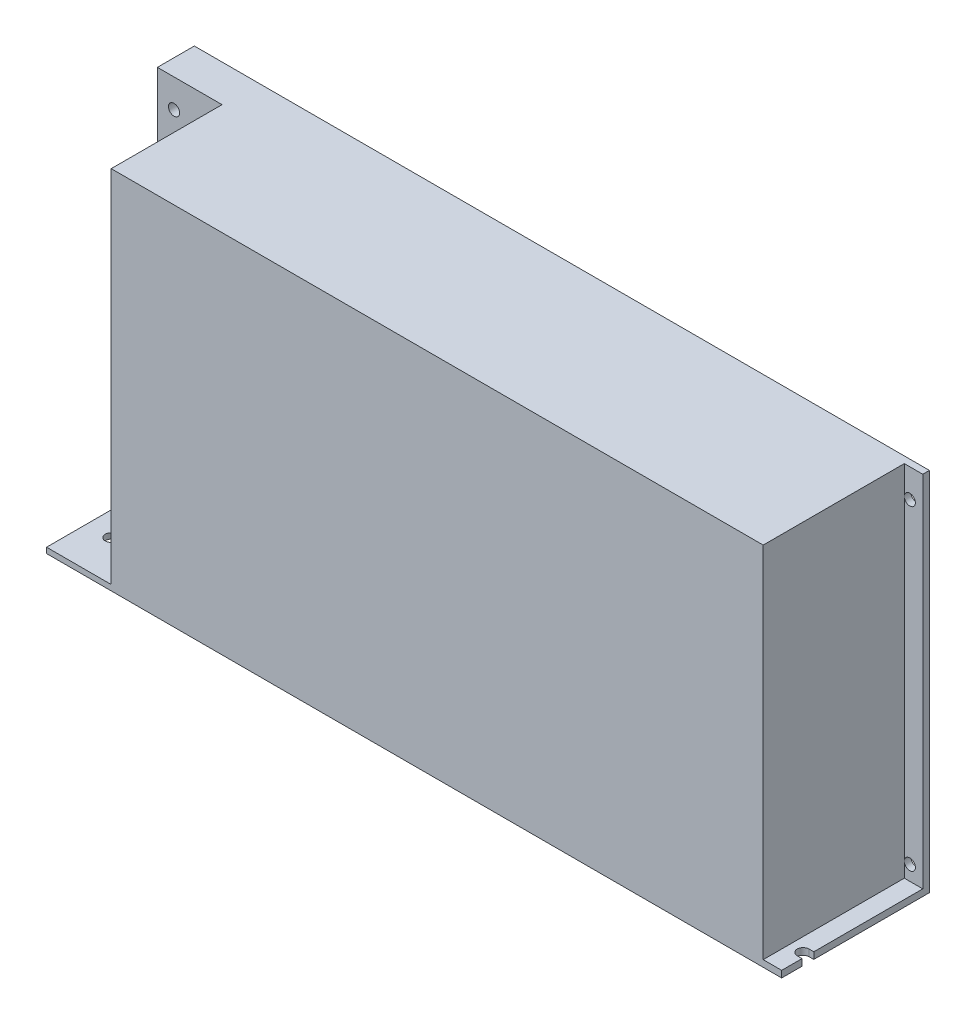
ISO-10303-21;
HEADER;
FILE_DESCRIPTION(('STEP AP214'),'2;1');
FILE_NAME('part.step','',(''),(''),'','','');
FILE_SCHEMA(('AUTOMOTIVE_DESIGN { 1 0 10303 214 1 1 1 1 }'));
ENDSEC;
DATA;
#1=APPLICATION_CONTEXT('core data for automotive mechanical design processes');
#2=APPLICATION_PROTOCOL_DEFINITION('international standard','automotive_design',2000,#1);
#3=PRODUCT_CONTEXT('',#1,'mechanical');
#4=PRODUCT('Part','Part','',(#3));
#5=PRODUCT_RELATED_PRODUCT_CATEGORY('part','',(#4));
#6=PRODUCT_DEFINITION_FORMATION('','',#4);
#7=PRODUCT_DEFINITION_CONTEXT('part definition',#1,'design');
#8=PRODUCT_DEFINITION('design','',#6,#7);
#9=PRODUCT_DEFINITION_SHAPE('','',#8);
#10=(LENGTH_UNIT() NAMED_UNIT(*) SI_UNIT(.MILLI.,.METRE.));
#11=(NAMED_UNIT(*) PLANE_ANGLE_UNIT() SI_UNIT($,.RADIAN.));
#12=(NAMED_UNIT(*) SI_UNIT($,.STERADIAN.) SOLID_ANGLE_UNIT());
#13=UNCERTAINTY_MEASURE_WITH_UNIT(LENGTH_MEASURE(1.E-05),#10,'distance_accuracy_value','');
#14=(GEOMETRIC_REPRESENTATION_CONTEXT(3) GLOBAL_UNCERTAINTY_ASSIGNED_CONTEXT((#13)) GLOBAL_UNIT_ASSIGNED_CONTEXT((#10,
#11,#12)) REPRESENTATION_CONTEXT('',''));
#15=CARTESIAN_POINT('',(0.,0.,0.));
#16=DIRECTION('',(0.,0.,1.));
#17=DIRECTION('',(1.,0.,0.));
#18=AXIS2_PLACEMENT_3D('',#15,#16,#17);
#19=CARTESIAN_POINT('',(99.5,49.5,40.));
#20=DIRECTION('',(-1.,0.,0.));
#21=DIRECTION('',(0.,0.,1.));
#22=AXIS2_PLACEMENT_3D('',#19,#20,#21);
#23=PLANE('',#22);
#24=DIRECTION('',(0.,0.,-1.));
#25=VECTOR('',#24,1.);
#26=CARTESIAN_POINT('',(99.5,-49.5,40.));
#27=LINE('',#26,#25);
#28=CARTESIAN_POINT('',(99.5,-49.5,40.));
#29=VERTEX_POINT('',#28);
#30=CARTESIAN_POINT('',(99.5,-49.5,34.5));
#31=VERTEX_POINT('',#30);
#32=EDGE_CURVE('E323',#29,#31,#27,.T.);
#33=ORIENTED_EDGE('',*,*,#32,.T.);
#34=DIRECTION('',(0.,-1.,0.));
#35=VECTOR('',#34,1.);
#36=CARTESIAN_POINT('',(99.5,-39.5,34.5));
#37=LINE('',#36,#35);
#38=CARTESIAN_POINT('',(99.5,-47.7,34.5));
#39=VERTEX_POINT('',#38);
#40=EDGE_CURVE('E171',#39,#31,#37,.T.);
#41=ORIENTED_EDGE('',*,*,#40,.F.);
#42=DIRECTION('',(0.,0.,1.));
#43=VECTOR('',#42,1.);
#44=CARTESIAN_POINT('',(99.5,-47.7,40.));
#45=LINE('',#44,#43);
#46=CARTESIAN_POINT('',(99.5,-47.7,40.));
#47=VERTEX_POINT('',#46);
#48=EDGE_CURVE('E259',#39,#47,#45,.T.);
#49=ORIENTED_EDGE('',*,*,#48,.T.);
#50=DIRECTION('',(0.,1.,0.));
#51=VECTOR('',#50,1.);
#52=CARTESIAN_POINT('',(99.5,49.5,40.));
#53=LINE('',#52,#51);
#54=EDGE_CURVE('E303',#29,#47,#53,.T.);
#55=ORIENTED_EDGE('',*,*,#54,.F.);
#56=EDGE_LOOP('',(#33,#41,#49,#55));
#57=FACE_BOUND('',#56,.T.);
#58=ADVANCED_FACE('F34',(#57),#23,.F.);
#59=CARTESIAN_POINT('',(-99.5,-49.5,0.));
#60=DIRECTION('',(0.,0.,1.));
#61=DIRECTION('',(1.,0.,0.));
#62=AXIS2_PLACEMENT_3D('',#59,#60,#61);
#63=PLANE('',#62);
#64=CARTESIAN_POINT('',(-95.,41.8,0.));
#65=DIRECTION('',(0.,0.,-1.));
#66=DIRECTION('',(1.,0.,0.));
#67=AXIS2_PLACEMENT_3D('',#64,#65,#66);
#68=CIRCLE('',#67,1.5);
#69=CARTESIAN_POINT('',(-93.5,41.8,0.));
#70=VERTEX_POINT('',#69);
#71=EDGE_CURVE('E349',#70,#70,#68,.T.);
#72=ORIENTED_EDGE('',*,*,#71,.F.);
#73=EDGE_LOOP('',(#72));
#74=FACE_BOUND('',#73,.T.);
#75=CARTESIAN_POINT('',(-95.,-43.7,0.));
#76=DIRECTION('',(0.,0.,-1.));
#77=DIRECTION('',(-1.,0.,0.));
#78=AXIS2_PLACEMENT_3D('',#75,#76,#77);
#79=CIRCLE('',#78,1.5);
#80=CARTESIAN_POINT('',(-96.5,-43.7,0.));
#81=VERTEX_POINT('',#80);
#82=EDGE_CURVE('E339',#81,#81,#79,.T.);
#83=ORIENTED_EDGE('',*,*,#82,.F.);
#84=EDGE_LOOP('',(#83));
#85=FACE_BOUND('',#84,.T.);
#86=CARTESIAN_POINT('',(96.,-43.7,0.));
#87=DIRECTION('',(0.,0.,-1.));
#88=DIRECTION('',(1.,0.,0.));
#89=AXIS2_PLACEMENT_3D('',#86,#87,#88);
#90=CIRCLE('',#89,1.5);
#91=CARTESIAN_POINT('',(97.5,-43.7,0.));
#92=VERTEX_POINT('',#91);
#93=EDGE_CURVE('E336',#92,#92,#90,.T.);
#94=ORIENTED_EDGE('',*,*,#93,.F.);
#95=EDGE_LOOP('',(#94));
#96=FACE_BOUND('',#95,.T.);
#97=CARTESIAN_POINT('',(96.,41.8,0.));
#98=DIRECTION('',(0.,0.,-1.));
#99=DIRECTION('',(-1.,0.,0.));
#100=AXIS2_PLACEMENT_3D('',#97,#98,#99);
#101=CIRCLE('',#100,1.5);
#102=CARTESIAN_POINT('',(94.5,41.8,0.));
#103=VERTEX_POINT('',#102);
#104=EDGE_CURVE('E335',#103,#103,#101,.T.);
#105=ORIENTED_EDGE('',*,*,#104,.F.);
#106=EDGE_LOOP('',(#105));
#107=FACE_BOUND('',#106,.T.);
#108=CARTESIAN_POINT('',(-41.5,-40.2,0.));
#109=DIRECTION('',(0.,0.,1.));
#110=DIRECTION('',(1.,0.,0.));
#111=AXIS2_PLACEMENT_3D('',#108,#109,#110);
#112=CIRCLE('',#111,2.);
#113=CARTESIAN_POINT('',(-39.5,-40.2,0.));
#114=VERTEX_POINT('',#113);
#115=EDGE_CURVE('E214',#114,#114,#112,.T.);
#116=ORIENTED_EDGE('',*,*,#115,.T.);
#117=EDGE_LOOP('',(#116));
#118=FACE_BOUND('',#117,.T.);
#119=CARTESIAN_POINT('',(-41.5,39.8,0.));
#120=DIRECTION('',(0.,0.,1.));
#121=DIRECTION('',(1.,0.,0.));
#122=AXIS2_PLACEMENT_3D('',#119,#120,#121);
#123=CIRCLE('',#122,2.);
#124=CARTESIAN_POINT('',(-39.5,39.8,0.));
#125=VERTEX_POINT('',#124);
#126=EDGE_CURVE('E226',#125,#125,#123,.T.);
#127=ORIENTED_EDGE('',*,*,#126,.T.);
#128=EDGE_LOOP('',(#127));
#129=FACE_BOUND('',#128,.T.);
#130=DIRECTION('',(0.,-1.,0.));
#131=VECTOR('',#130,1.);
#132=CARTESIAN_POINT('',(-99.5,49.5,0.));
#133=LINE('',#132,#131);
#134=CARTESIAN_POINT('',(-99.5,49.5,0.));
#135=VERTEX_POINT('',#134);
#136=CARTESIAN_POINT('',(-99.5,-49.5,0.));
#137=VERTEX_POINT('',#136);
#138=EDGE_CURVE('E286',#135,#137,#133,.T.);
#139=ORIENTED_EDGE('',*,*,#138,.F.);
#140=DIRECTION('',(-1.,0.,0.));
#141=VECTOR('',#140,1.);
#142=CARTESIAN_POINT('',(-99.5,49.5,0.));
#143=LINE('',#142,#141);
#144=CARTESIAN_POINT('',(99.5,49.5,0.));
#145=VERTEX_POINT('',#144);
#146=EDGE_CURVE('E301',#145,#135,#143,.T.);
#147=ORIENTED_EDGE('',*,*,#146,.F.);
#148=DIRECTION('',(0.,1.,0.));
#149=VECTOR('',#148,1.);
#150=CARTESIAN_POINT('',(99.5,49.5,0.));
#151=LINE('',#150,#149);
#152=CARTESIAN_POINT('',(99.5,-49.5,0.));
#153=VERTEX_POINT('',#152);
#154=EDGE_CURVE('E314',#153,#145,#151,.T.);
#155=ORIENTED_EDGE('',*,*,#154,.F.);
#156=DIRECTION('',(1.,0.,0.));
#157=VECTOR('',#156,1.);
#158=CARTESIAN_POINT('',(-99.5,-49.5,0.));
#159=LINE('',#158,#157);
#160=EDGE_CURVE('E311',#137,#153,#159,.T.);
#161=ORIENTED_EDGE('',*,*,#160,.F.);
#162=EDGE_LOOP('',(#139,#147,#155,#161));
#163=FACE_BOUND('',#162,.T.);
#164=CARTESIAN_POINT('',(78.5,39.8,0.));
#165=DIRECTION('',(0.,0.,1.));
#166=DIRECTION('',(1.,0.,0.));
#167=AXIS2_PLACEMENT_3D('',#164,#165,#166);
#168=CIRCLE('',#167,2.);
#169=CARTESIAN_POINT('',(80.5,39.8,0.));
#170=VERTEX_POINT('',#169);
#171=EDGE_CURVE('E220',#170,#170,#168,.T.);
#172=ORIENTED_EDGE('',*,*,#171,.T.);
#173=EDGE_LOOP('',(#172));
#174=FACE_BOUND('',#173,.T.);
#175=CARTESIAN_POINT('',(78.5,-40.2,0.));
#176=DIRECTION('',(0.,0.,1.));
#177=DIRECTION('',(1.,0.,0.));
#178=AXIS2_PLACEMENT_3D('',#175,#176,#177);
#179=CIRCLE('',#178,2.);
#180=CARTESIAN_POINT('',(80.5,-40.2,0.));
#181=VERTEX_POINT('',#180);
#182=EDGE_CURVE('E208',#181,#181,#179,.T.);
#183=ORIENTED_EDGE('',*,*,#182,.T.);
#184=EDGE_LOOP('',(#183));
#185=FACE_BOUND('',#184,.T.);
#186=ADVANCED_FACE('F357',(#74,#85,#96,#107,#118,#129,#163,#174,#185),#63,.F.);
#187=CARTESIAN_POINT('',(-99.5,49.5,40.));
#188=DIRECTION('',(1.,0.,0.));
#189=DIRECTION('',(0.,1.,0.));
#190=AXIS2_PLACEMENT_3D('',#187,#188,#189);
#191=PLANE('',#190);
#192=DIRECTION('',(0.,0.,1.));
#193=VECTOR('',#192,1.);
#194=CARTESIAN_POINT('',(-99.5,-48.,-99.0580637807948));
#195=LINE('',#194,#193);
#196=CARTESIAN_POINT('',(-99.5,-48.,1.8));
#197=VERTEX_POINT('',#196);
#198=CARTESIAN_POINT('',(-99.5,-48.,40.));
#199=VERTEX_POINT('',#198);
#200=EDGE_CURVE('E292',#197,#199,#195,.T.);
#201=ORIENTED_EDGE('',*,*,#200,.F.);
#202=DIRECTION('',(0.,1.,0.));
#203=VECTOR('',#202,1.);
#204=CARTESIAN_POINT('',(-99.5,-48.,1.8));
#205=LINE('',#204,#203);
#206=CARTESIAN_POINT('',(-99.5,-39.,1.8));
#207=VERTEX_POINT('',#206);
#208=EDGE_CURVE('E235',#197,#207,#205,.T.);
#209=ORIENTED_EDGE('',*,*,#208,.T.);
#210=DIRECTION('',(0.,0.,1.));
#211=VECTOR('',#210,1.);
#212=CARTESIAN_POINT('',(-99.5,-39.,-19.6786686541544));
#213=LINE('',#212,#211);
#214=CARTESIAN_POINT('',(-99.5,-39.,10.));
#215=VERTEX_POINT('',#214);
#216=EDGE_CURVE('E239',#207,#215,#213,.T.);
#217=ORIENTED_EDGE('',*,*,#216,.T.);
#218=DIRECTION('',(0.,1.,0.));
#219=VECTOR('',#218,1.);
#220=CARTESIAN_POINT('',(-99.5,49.5,9.99999999999999));
#221=LINE('',#220,#219);
#222=CARTESIAN_POINT('',(-99.5,49.5,9.99999999999999));
#223=VERTEX_POINT('',#222);
#224=EDGE_CURVE('E284',#215,#223,#221,.T.);
#225=ORIENTED_EDGE('',*,*,#224,.T.);
#226=DIRECTION('',(0.,0.,-1.));
#227=VECTOR('',#226,1.);
#228=CARTESIAN_POINT('',(-99.5,49.5,40.));
#229=LINE('',#228,#227);
#230=EDGE_CURVE('E308',#223,#135,#229,.T.);
#231=ORIENTED_EDGE('',*,*,#230,.T.);
#232=ORIENTED_EDGE('',*,*,#138,.T.);
#233=DIRECTION('',(0.,0.,-1.));
#234=VECTOR('',#233,1.);
#235=CARTESIAN_POINT('',(-99.5,-49.5,40.));
#236=LINE('',#235,#234);
#237=CARTESIAN_POINT('',(-99.5,-49.5,40.));
#238=VERTEX_POINT('',#237);
#239=EDGE_CURVE('E325',#238,#137,#236,.T.);
#240=ORIENTED_EDGE('',*,*,#239,.F.);
#241=DIRECTION('',(0.,-1.,0.));
#242=VECTOR('',#241,1.);
#243=CARTESIAN_POINT('',(-99.5,49.5,40.));
#244=LINE('',#243,#242);
#245=EDGE_CURVE('E298',#199,#238,#244,.T.);
#246=ORIENTED_EDGE('',*,*,#245,.F.);
#247=EDGE_LOOP('',(#201,#209,#217,#225,#231,#232,#240,#246));
#248=FACE_BOUND('',#247,.T.);
#249=ADVANCED_FACE('F36',(#248),#191,.F.);
#250=CARTESIAN_POINT('',(-99.5,-49.5,40.));
#251=DIRECTION('',(0.,1.,0.));
#252=DIRECTION('',(-1.,0.,0.));
#253=AXIS2_PLACEMENT_3D('',#250,#251,#252);
#254=PLANE('',#253);
#255=CARTESIAN_POINT('',(-93.,-49.5,29.));
#256=DIRECTION('',(0.,-1.,0.));
#257=DIRECTION('',(0.,0.,-1.));
#258=AXIS2_PLACEMENT_3D('',#255,#256,#257);
#259=CIRCLE('',#258,1.6);
#260=CARTESIAN_POINT('',(-93.,-49.5,27.4));
#261=VERTEX_POINT('',#260);
#262=EDGE_CURVE('E184',#261,#261,#259,.T.);
#263=ORIENTED_EDGE('',*,*,#262,.F.);
#264=EDGE_LOOP('',(#263));
#265=FACE_BOUND('',#264,.T.);
#266=CARTESIAN_POINT('',(77.5,-49.5,30.5));
#267=DIRECTION('',(0.,-1.,0.));
#268=DIRECTION('',(0.,0.,-1.));
#269=AXIS2_PLACEMENT_3D('',#266,#267,#268);
#270=CIRCLE('',#269,1.5);
#271=CARTESIAN_POINT('',(77.5,-49.5,29.));
#272=VERTEX_POINT('',#271);
#273=EDGE_CURVE('E196',#272,#272,#270,.T.);
#274=ORIENTED_EDGE('',*,*,#273,.F.);
#275=EDGE_LOOP('',(#274));
#276=FACE_BOUND('',#275,.T.);
#277=CARTESIAN_POINT('',(77.5,-49.5,12.5));
#278=DIRECTION('',(0.,-1.,0.));
#279=DIRECTION('',(0.,0.,-1.));
#280=AXIS2_PLACEMENT_3D('',#277,#278,#279);
#281=CIRCLE('',#280,1.5);
#282=CARTESIAN_POINT('',(77.5,-49.5,11.));
#283=VERTEX_POINT('',#282);
#284=EDGE_CURVE('E195',#283,#283,#281,.T.);
#285=ORIENTED_EDGE('',*,*,#284,.F.);
#286=EDGE_LOOP('',(#285));
#287=FACE_BOUND('',#286,.T.);
#288=CARTESIAN_POINT('',(-79.5,-49.5,20.));
#289=DIRECTION('',(0.,-1.,0.));
#290=DIRECTION('',(0.,0.,-1.));
#291=AXIS2_PLACEMENT_3D('',#288,#289,#290);
#292=CIRCLE('',#291,1.5);
#293=CARTESIAN_POINT('',(-79.5,-49.5,18.5));
#294=VERTEX_POINT('',#293);
#295=EDGE_CURVE('E202',#294,#294,#292,.T.);
#296=ORIENTED_EDGE('',*,*,#295,.F.);
#297=EDGE_LOOP('',(#296));
#298=FACE_BOUND('',#297,.T.);
#299=CARTESIAN_POINT('',(98.2,-49.5,32.9));
#300=DIRECTION('',(0.,-1.,0.));
#301=DIRECTION('',(0.,0.,-1.));
#302=AXIS2_PLACEMENT_3D('',#299,#300,#301);
#303=CIRCLE('',#302,1.6);
#304=CARTESIAN_POINT('',(98.2,-49.5,34.5));
#305=VERTEX_POINT('',#304);
#306=CARTESIAN_POINT('',(98.2,-49.5,31.3));
#307=VERTEX_POINT('',#306);
#308=EDGE_CURVE('E158',#305,#307,#303,.T.);
#309=ORIENTED_EDGE('',*,*,#308,.F.);
#310=DIRECTION('',(-1.,0.,0.));
#311=VECTOR('',#310,1.);
#312=CARTESIAN_POINT('',(99.5,-49.5,34.5));
#313=LINE('',#312,#311);
#314=EDGE_CURVE('E168',#31,#305,#313,.T.);
#315=ORIENTED_EDGE('',*,*,#314,.F.);
#316=ORIENTED_EDGE('',*,*,#32,.F.);
#317=DIRECTION('',(1.,0.,0.));
#318=VECTOR('',#317,1.);
#319=CARTESIAN_POINT('',(-99.5,-49.5,40.));
#320=LINE('',#319,#318);
#321=EDGE_CURVE('E300',#238,#29,#320,.T.);
#322=ORIENTED_EDGE('',*,*,#321,.F.);
#323=ORIENTED_EDGE('',*,*,#239,.T.);
#324=ORIENTED_EDGE('',*,*,#160,.T.);
#325=CARTESIAN_POINT('',(99.5,-49.5,31.3));
#326=VERTEX_POINT('',#325);
#327=EDGE_CURVE('E322',#326,#153,#27,.T.);
#328=ORIENTED_EDGE('',*,*,#327,.F.);
#329=DIRECTION('',(1.,0.,0.));
#330=VECTOR('',#329,1.);
#331=CARTESIAN_POINT('',(99.5,-49.5,31.3));
#332=LINE('',#331,#330);
#333=EDGE_CURVE('E165',#307,#326,#332,.T.);
#334=ORIENTED_EDGE('',*,*,#333,.F.);
#335=EDGE_LOOP('',(#309,#315,#316,#322,#323,#324,#328,#334));
#336=FACE_BOUND('',#335,.T.);
#337=ADVANCED_FACE('F177',(#265,#276,#287,#298,#336),#254,.F.);
#338=CARTESIAN_POINT('',(99.5,-47.7,1.8));
#339=VERTEX_POINT('',#338);
#340=CARTESIAN_POINT('',(99.5,-47.7,31.3));
#341=VERTEX_POINT('',#340);
#342=EDGE_CURVE('E260',#339,#341,#45,.T.);
#343=ORIENTED_EDGE('',*,*,#342,.T.);
#344=DIRECTION('',(0.,-1.,0.));
#345=VECTOR('',#344,1.);
#346=CARTESIAN_POINT('',(99.5,-39.5,31.3));
#347=LINE('',#346,#345);
#348=EDGE_CURVE('E185',#341,#326,#347,.T.);
#349=ORIENTED_EDGE('',*,*,#348,.T.);
#350=ORIENTED_EDGE('',*,*,#327,.T.);
#351=ORIENTED_EDGE('',*,*,#154,.T.);
#352=DIRECTION('',(0.,0.,-1.));
#353=VECTOR('',#352,1.);
#354=CARTESIAN_POINT('',(99.5,49.5,40.));
#355=LINE('',#354,#353);
#356=CARTESIAN_POINT('',(99.5,49.5,1.8));
#357=VERTEX_POINT('',#356);
#358=EDGE_CURVE('E320',#357,#145,#355,.T.);
#359=ORIENTED_EDGE('',*,*,#358,.F.);
#360=DIRECTION('',(0.,1.,0.));
#361=VECTOR('',#360,1.);
#362=CARTESIAN_POINT('',(99.5,-88.0258354873713,1.8));
#363=LINE('',#362,#361);
#364=EDGE_CURVE('E269',#339,#357,#363,.T.);
#365=ORIENTED_EDGE('',*,*,#364,.F.);
#366=EDGE_LOOP('',(#343,#349,#350,#351,#359,#365));
#367=FACE_BOUND('',#366,.T.);
#368=ADVANCED_FACE('F392',(#367),#23,.F.);
#369=CARTESIAN_POINT('',(-99.5,49.5,40.));
#370=DIRECTION('',(0.,-1.,0.));
#371=DIRECTION('',(1.,0.,0.));
#372=AXIS2_PLACEMENT_3D('',#369,#370,#371);
#373=PLANE('',#372);
#374=DIRECTION('',(-1.,0.,0.));
#375=VECTOR('',#374,1.);
#376=CARTESIAN_POINT('',(-99.5,49.5,40.));
#377=LINE('',#376,#375);
#378=CARTESIAN_POINT('',(94.5,49.5,40.));
#379=VERTEX_POINT('',#378);
#380=CARTESIAN_POINT('',(-82.,49.5,40.));
#381=VERTEX_POINT('',#380);
#382=EDGE_CURVE('E306',#379,#381,#377,.T.);
#383=ORIENTED_EDGE('',*,*,#382,.F.);
#384=DIRECTION('',(0.,0.,1.));
#385=VECTOR('',#384,1.);
#386=CARTESIAN_POINT('',(94.5,49.5,40.));
#387=LINE('',#386,#385);
#388=CARTESIAN_POINT('',(94.5,49.5,1.8));
#389=VERTEX_POINT('',#388);
#390=EDGE_CURVE('E266',#389,#379,#387,.T.);
#391=ORIENTED_EDGE('',*,*,#390,.F.);
#392=DIRECTION('',(-1.,0.,0.));
#393=VECTOR('',#392,1.);
#394=CARTESIAN_POINT('',(99.5,49.5,1.8));
#395=LINE('',#394,#393);
#396=EDGE_CURVE('E252',#357,#389,#395,.T.);
#397=ORIENTED_EDGE('',*,*,#396,.F.);
#398=ORIENTED_EDGE('',*,*,#358,.T.);
#399=ORIENTED_EDGE('',*,*,#146,.T.);
#400=ORIENTED_EDGE('',*,*,#230,.F.);
#401=DIRECTION('',(1.,0.,0.));
#402=VECTOR('',#401,1.);
#403=CARTESIAN_POINT('',(-99.5,49.5,9.99999999999999));
#404=LINE('',#403,#402);
#405=CARTESIAN_POINT('',(-82.,49.5,9.99999999999999));
#406=VERTEX_POINT('',#405);
#407=EDGE_CURVE('E280',#223,#406,#404,.T.);
#408=ORIENTED_EDGE('',*,*,#407,.T.);
#409=DIRECTION('',(0.,0.,1.));
#410=VECTOR('',#409,1.);
#411=CARTESIAN_POINT('',(-82.,49.5,-99.0580637807948));
#412=LINE('',#411,#410);
#413=EDGE_CURVE('E281',#406,#381,#412,.T.);
#414=ORIENTED_EDGE('',*,*,#413,.T.);
#415=EDGE_LOOP('',(#383,#391,#397,#398,#399,#400,#408,#414));
#416=FACE_BOUND('',#415,.T.);
#417=ADVANCED_FACE('F397',(#416),#373,.F.);
#418=CARTESIAN_POINT('',(-99.5,-49.5,40.));
#419=DIRECTION('',(0.,0.,1.));
#420=DIRECTION('',(1.,0.,0.));
#421=AXIS2_PLACEMENT_3D('',#418,#419,#420);
#422=PLANE('',#421);
#423=DIRECTION('',(0.,1.,0.));
#424=VECTOR('',#423,1.);
#425=CARTESIAN_POINT('',(94.5,-88.0258354873713,40.));
#426=LINE('',#425,#424);
#427=CARTESIAN_POINT('',(94.5,-47.7,40.));
#428=VERTEX_POINT('',#427);
#429=EDGE_CURVE('E256',#428,#379,#426,.T.);
#430=ORIENTED_EDGE('',*,*,#429,.T.);
#431=ORIENTED_EDGE('',*,*,#382,.T.);
#432=DIRECTION('',(0.,1.,0.));
#433=VECTOR('',#432,1.);
#434=CARTESIAN_POINT('',(-82.,49.5,40.));
#435=LINE('',#434,#433);
#436=CARTESIAN_POINT('',(-82.,-48.,40.));
#437=VERTEX_POINT('',#436);
#438=EDGE_CURVE('E289',#437,#381,#435,.T.);
#439=ORIENTED_EDGE('',*,*,#438,.F.);
#440=DIRECTION('',(1.,0.,0.));
#441=VECTOR('',#440,1.);
#442=CARTESIAN_POINT('',(-99.5,-48.,40.));
#443=LINE('',#442,#441);
#444=EDGE_CURVE('E276',#199,#437,#443,.T.);
#445=ORIENTED_EDGE('',*,*,#444,.F.);
#446=ORIENTED_EDGE('',*,*,#245,.T.);
#447=ORIENTED_EDGE('',*,*,#321,.T.);
#448=ORIENTED_EDGE('',*,*,#54,.T.);
#449=DIRECTION('',(-1.,0.,0.));
#450=VECTOR('',#449,1.);
#451=CARTESIAN_POINT('',(99.5,-47.7,40.));
#452=LINE('',#451,#450);
#453=EDGE_CURVE('E255',#47,#428,#452,.T.);
#454=ORIENTED_EDGE('',*,*,#453,.T.);
#455=EDGE_LOOP('',(#430,#431,#439,#445,#446,#447,#448,#454));
#456=FACE_BOUND('',#455,.T.);
#457=ADVANCED_FACE('F403',(#456),#422,.T.);
#458=CARTESIAN_POINT('',(-82.,49.5,-99.0580637807948));
#459=DIRECTION('',(1.,0.,0.));
#460=DIRECTION('',(0.,1.,0.));
#461=AXIS2_PLACEMENT_3D('',#458,#459,#460);
#462=PLANE('',#461);
#463=DIRECTION('',(0.,-1.,0.));
#464=VECTOR('',#463,1.);
#465=CARTESIAN_POINT('',(-82.,49.5,9.99999999999999));
#466=LINE('',#465,#464);
#467=CARTESIAN_POINT('',(-82.,-39.,9.99999999999999));
#468=VERTEX_POINT('',#467);
#469=EDGE_CURVE('E277',#406,#468,#466,.T.);
#470=ORIENTED_EDGE('',*,*,#469,.T.);
#471=DIRECTION('',(0.,0.,1.));
#472=VECTOR('',#471,1.);
#473=CARTESIAN_POINT('',(-82.,-39.,-19.6786686541544));
#474=LINE('',#473,#472);
#475=CARTESIAN_POINT('',(-82.,-39.,1.8));
#476=VERTEX_POINT('',#475);
#477=EDGE_CURVE('E247',#476,#468,#474,.T.);
#478=ORIENTED_EDGE('',*,*,#477,.F.);
#479=DIRECTION('',(0.,-1.,0.));
#480=VECTOR('',#479,1.);
#481=CARTESIAN_POINT('',(-82.,-48.,1.8));
#482=LINE('',#481,#480);
#483=CARTESIAN_POINT('',(-82.,-48.,1.8));
#484=VERTEX_POINT('',#483);
#485=EDGE_CURVE('E242',#476,#484,#482,.T.);
#486=ORIENTED_EDGE('',*,*,#485,.T.);
#487=DIRECTION('',(0.,0.,1.));
#488=VECTOR('',#487,1.);
#489=CARTESIAN_POINT('',(-82.,-48.,-99.0580637807948));
#490=LINE('',#489,#488);
#491=EDGE_CURVE('E295',#484,#437,#490,.T.);
#492=ORIENTED_EDGE('',*,*,#491,.T.);
#493=ORIENTED_EDGE('',*,*,#438,.T.);
#494=ORIENTED_EDGE('',*,*,#413,.F.);
#495=EDGE_LOOP('',(#470,#478,#486,#492,#493,#494));
#496=FACE_BOUND('',#495,.T.);
#497=ADVANCED_FACE('F520',(#496),#462,.F.);
#498=CARTESIAN_POINT('',(-99.5,-48.,-99.0580637807948));
#499=DIRECTION('',(0.,-1.,0.));
#500=DIRECTION('',(0.,0.,-1.));
#501=AXIS2_PLACEMENT_3D('',#498,#499,#500);
#502=PLANE('',#501);
#503=CARTESIAN_POINT('',(-93.,-48.,29.));
#504=DIRECTION('',(0.,-1.,0.));
#505=DIRECTION('',(0.,0.,-1.));
#506=AXIS2_PLACEMENT_3D('',#503,#504,#505);
#507=CIRCLE('',#506,1.6);
#508=CARTESIAN_POINT('',(-93.,-48.,27.4));
#509=VERTEX_POINT('',#508);
#510=EDGE_CURVE('E191',#509,#509,#507,.T.);
#511=ORIENTED_EDGE('',*,*,#510,.T.);
#512=EDGE_LOOP('',(#511));
#513=FACE_BOUND('',#512,.T.);
#514=ORIENTED_EDGE('',*,*,#491,.F.);
#515=DIRECTION('',(-1.,0.,0.));
#516=VECTOR('',#515,1.);
#517=CARTESIAN_POINT('',(-82.,-48.,1.8));
#518=LINE('',#517,#516);
#519=EDGE_CURVE('E238',#484,#197,#518,.T.);
#520=ORIENTED_EDGE('',*,*,#519,.T.);
#521=ORIENTED_EDGE('',*,*,#200,.T.);
#522=ORIENTED_EDGE('',*,*,#444,.T.);
#523=EDGE_LOOP('',(#514,#520,#521,#522));
#524=FACE_BOUND('',#523,.T.);
#525=ADVANCED_FACE('F535',(#513,#524),#502,.F.);
#526=CARTESIAN_POINT('',(-99.5,-49.5,10.));
#527=DIRECTION('',(0.,0.,1.));
#528=DIRECTION('',(1.,0.,0.));
#529=AXIS2_PLACEMENT_3D('',#526,#527,#528);
#530=PLANE('',#529);
#531=CARTESIAN_POINT('',(-95.,41.8,10.));
#532=DIRECTION('',(0.,0.,1.));
#533=DIRECTION('',(1.,0.,0.));
#534=AXIS2_PLACEMENT_3D('',#531,#532,#533);
#535=CIRCLE('',#534,1.5);
#536=CARTESIAN_POINT('',(-93.5,41.8,10.));
#537=VERTEX_POINT('',#536);
#538=EDGE_CURVE('E38',#537,#537,#535,.T.);
#539=ORIENTED_EDGE('',*,*,#538,.F.);
#540=EDGE_LOOP('',(#539));
#541=FACE_BOUND('',#540,.T.);
#542=DIRECTION('',(-1.,0.,0.));
#543=VECTOR('',#542,1.);
#544=CARTESIAN_POINT('',(-82.,-39.,10.));
#545=LINE('',#544,#543);
#546=EDGE_CURVE('E232',#468,#215,#545,.T.);
#547=ORIENTED_EDGE('',*,*,#546,.F.);
#548=ORIENTED_EDGE('',*,*,#469,.F.);
#549=ORIENTED_EDGE('',*,*,#407,.F.);
#550=ORIENTED_EDGE('',*,*,#224,.F.);
#551=EDGE_LOOP('',(#547,#548,#549,#550));
#552=FACE_BOUND('',#551,.T.);
#553=ADVANCED_FACE('F529',(#541,#552),#530,.T.);
#554=CARTESIAN_POINT('',(94.5,-88.0258354873713,40.));
#555=DIRECTION('',(-1.,0.,0.));
#556=DIRECTION('',(0.,0.,1.));
#557=AXIS2_PLACEMENT_3D('',#554,#555,#556);
#558=PLANE('',#557);
#559=ORIENTED_EDGE('',*,*,#390,.T.);
#560=ORIENTED_EDGE('',*,*,#429,.F.);
#561=DIRECTION('',(0.,0.,-1.));
#562=VECTOR('',#561,1.);
#563=CARTESIAN_POINT('',(94.5,-47.7,40.));
#564=LINE('',#563,#562);
#565=CARTESIAN_POINT('',(94.5,-47.7,1.8));
#566=VERTEX_POINT('',#565);
#567=EDGE_CURVE('E253',#428,#566,#564,.T.);
#568=ORIENTED_EDGE('',*,*,#567,.T.);
#569=DIRECTION('',(0.,1.,0.));
#570=VECTOR('',#569,1.);
#571=CARTESIAN_POINT('',(94.5,-88.0258354873713,1.8));
#572=LINE('',#571,#570);
#573=CARTESIAN_POINT('',(94.5,-43.7,1.8));
#574=VERTEX_POINT('',#573);
#575=EDGE_CURVE('E271',#566,#574,#572,.T.);
#576=ORIENTED_EDGE('',*,*,#575,.T.);
#577=CARTESIAN_POINT('',(94.5,41.8,1.8));
#578=VERTEX_POINT('',#577);
#579=EDGE_CURVE('E56',#574,#578,#572,.T.);
#580=ORIENTED_EDGE('',*,*,#579,.T.);
#581=EDGE_CURVE('E273',#578,#389,#572,.T.);
#582=ORIENTED_EDGE('',*,*,#581,.T.);
#583=EDGE_LOOP('',(#559,#560,#568,#576,#580,#582));
#584=FACE_BOUND('',#583,.T.);
#585=ADVANCED_FACE('F534',(#584),#558,.F.);
#586=CARTESIAN_POINT('',(99.5,-88.0258354873713,1.8));
#587=DIRECTION('',(0.,0.,-1.));
#588=DIRECTION('',(-1.,0.,0.));
#589=AXIS2_PLACEMENT_3D('',#586,#587,#588);
#590=PLANE('',#589);
#591=ORIENTED_EDGE('',*,*,#579,.F.);
#592=CARTESIAN_POINT('',(96.,-43.7,1.8));
#593=DIRECTION('',(0.,0.,-1.));
#594=DIRECTION('',(-1.,0.,0.));
#595=AXIS2_PLACEMENT_3D('',#592,#593,#594);
#596=CIRCLE('',#595,1.5);
#597=EDGE_CURVE('E49',#574,#574,#596,.T.);
#598=ORIENTED_EDGE('',*,*,#597,.T.);
#599=ORIENTED_EDGE('',*,*,#575,.F.);
#600=DIRECTION('',(1.,0.,0.));
#601=VECTOR('',#600,1.);
#602=CARTESIAN_POINT('',(99.5,-47.7,1.8));
#603=LINE('',#602,#601);
#604=EDGE_CURVE('E263',#566,#339,#603,.T.);
#605=ORIENTED_EDGE('',*,*,#604,.T.);
#606=ORIENTED_EDGE('',*,*,#364,.T.);
#607=ORIENTED_EDGE('',*,*,#396,.T.);
#608=ORIENTED_EDGE('',*,*,#581,.F.);
#609=CARTESIAN_POINT('',(96.,41.8,1.8));
#610=DIRECTION('',(0.,0.,-1.));
#611=DIRECTION('',(-1.,0.,0.));
#612=AXIS2_PLACEMENT_3D('',#609,#610,#611);
#613=CIRCLE('',#612,1.5);
#614=EDGE_CURVE('E175',#578,#578,#613,.T.);
#615=ORIENTED_EDGE('',*,*,#614,.T.);
#616=EDGE_LOOP('',(#591,#598,#599,#605,#606,#607,#608,#615));
#617=FACE_BOUND('',#616,.T.);
#618=ADVANCED_FACE('F547',(#617),#590,.F.);
#619=CARTESIAN_POINT('',(-99.5,-47.7,40.));
#620=DIRECTION('',(0.,1.,0.));
#621=DIRECTION('',(-1.,0.,0.));
#622=AXIS2_PLACEMENT_3D('',#619,#620,#621);
#623=PLANE('',#622);
#624=DIRECTION('',(1.,0.,0.));
#625=VECTOR('',#624,1.);
#626=CARTESIAN_POINT('',(-99.5,-47.7,34.5));
#627=LINE('',#626,#625);
#628=CARTESIAN_POINT('',(98.2,-47.7,34.5));
#629=VERTEX_POINT('',#628);
#630=EDGE_CURVE('E12',#629,#39,#627,.T.);
#631=ORIENTED_EDGE('',*,*,#630,.F.);
#632=CARTESIAN_POINT('',(98.2,-47.7,32.9));
#633=DIRECTION('',(0.,1.,0.));
#634=DIRECTION('',(-1.,0.,0.));
#635=AXIS2_PLACEMENT_3D('',#632,#633,#634);
#636=CIRCLE('',#635,1.6);
#637=CARTESIAN_POINT('',(98.2,-47.7,31.3));
#638=VERTEX_POINT('',#637);
#639=EDGE_CURVE('E161',#638,#629,#636,.T.);
#640=ORIENTED_EDGE('',*,*,#639,.F.);
#641=DIRECTION('',(-1.,0.,0.));
#642=VECTOR('',#641,1.);
#643=CARTESIAN_POINT('',(-99.5,-47.7,31.3));
#644=LINE('',#643,#642);
#645=EDGE_CURVE('E43',#341,#638,#644,.T.);
#646=ORIENTED_EDGE('',*,*,#645,.F.);
#647=ORIENTED_EDGE('',*,*,#342,.F.);
#648=ORIENTED_EDGE('',*,*,#604,.F.);
#649=ORIENTED_EDGE('',*,*,#567,.F.);
#650=ORIENTED_EDGE('',*,*,#453,.F.);
#651=ORIENTED_EDGE('',*,*,#48,.F.);
#652=EDGE_LOOP('',(#631,#640,#646,#647,#648,#649,#650,#651));
#653=FACE_BOUND('',#652,.T.);
#654=ADVANCED_FACE('F412',(#653),#623,.T.);
#655=CARTESIAN_POINT('',(-82.,-39.,-19.6786686541544));
#656=DIRECTION('',(0.,1.,0.));
#657=DIRECTION('',(-1.,0.,0.));
#658=AXIS2_PLACEMENT_3D('',#655,#656,#657);
#659=PLANE('',#658);
#660=DIRECTION('',(1.,0.,0.));
#661=VECTOR('',#660,1.);
#662=CARTESIAN_POINT('',(-82.,-39.,1.8));
#663=LINE('',#662,#661);
#664=EDGE_CURVE('E245',#207,#476,#663,.T.);
#665=ORIENTED_EDGE('',*,*,#664,.T.);
#666=ORIENTED_EDGE('',*,*,#477,.T.);
#667=ORIENTED_EDGE('',*,*,#546,.T.);
#668=ORIENTED_EDGE('',*,*,#216,.F.);
#669=EDGE_LOOP('',(#665,#666,#667,#668));
#670=FACE_BOUND('',#669,.T.);
#671=ADVANCED_FACE('F568',(#670),#659,.F.);
#672=CARTESIAN_POINT('',(-99.5,-49.5,1.8));
#673=DIRECTION('',(0.,0.,1.));
#674=DIRECTION('',(1.,0.,0.));
#675=AXIS2_PLACEMENT_3D('',#672,#673,#674);
#676=PLANE('',#675);
#677=CARTESIAN_POINT('',(-95.,-43.7,1.8));
#678=DIRECTION('',(0.,0.,1.));
#679=DIRECTION('',(1.,0.,0.));
#680=AXIS2_PLACEMENT_3D('',#677,#678,#679);
#681=CIRCLE('',#680,1.5);
#682=CARTESIAN_POINT('',(-93.5,-43.7,1.8));
#683=VERTEX_POINT('',#682);
#684=EDGE_CURVE('E337',#683,#683,#681,.T.);
#685=ORIENTED_EDGE('',*,*,#684,.F.);
#686=EDGE_LOOP('',(#685));
#687=FACE_BOUND('',#686,.T.);
#688=ORIENTED_EDGE('',*,*,#485,.F.);
#689=ORIENTED_EDGE('',*,*,#664,.F.);
#690=ORIENTED_EDGE('',*,*,#208,.F.);
#691=ORIENTED_EDGE('',*,*,#519,.F.);
#692=EDGE_LOOP('',(#688,#689,#690,#691));
#693=FACE_BOUND('',#692,.T.);
#694=ADVANCED_FACE('F563',(#687,#693),#676,.T.);
#695=CARTESIAN_POINT('',(-41.5,39.8,10.));
#696=DIRECTION('',(0.,0.,-1.));
#697=DIRECTION('',(-1.,0.,0.));
#698=AXIS2_PLACEMENT_3D('',#695,#696,#697);
#699=CYLINDRICAL_SURFACE('',#698,2.);
#700=CARTESIAN_POINT('',(-41.5,39.8,10.));
#701=DIRECTION('',(0.,0.,1.));
#702=DIRECTION('',(1.,0.,0.));
#703=AXIS2_PLACEMENT_3D('',#700,#701,#702);
#704=CIRCLE('',#703,2.);
#705=CARTESIAN_POINT('',(-39.5,39.8,10.));
#706=VERTEX_POINT('',#705);
#707=EDGE_CURVE('E229',#706,#706,#704,.T.);
#708=ORIENTED_EDGE('',*,*,#707,.T.);
#709=EDGE_LOOP('',(#708));
#710=FACE_BOUND('',#709,.T.);
#711=ORIENTED_EDGE('',*,*,#126,.F.);
#712=EDGE_LOOP('',(#711));
#713=FACE_BOUND('',#712,.T.);
#714=ADVANCED_FACE('F567',(#710,#713),#699,.F.);
#715=CARTESIAN_POINT('',(-41.5,39.8,10.));
#716=DIRECTION('',(0.,0.,1.));
#717=DIRECTION('',(1.,0.,0.));
#718=AXIS2_PLACEMENT_3D('',#715,#716,#717);
#719=PLANE('',#718);
#720=ORIENTED_EDGE('',*,*,#707,.F.);
#721=EDGE_LOOP('',(#720));
#722=FACE_BOUND('',#721,.T.);
#723=ADVANCED_FACE('F655',(#722),#719,.F.);
#724=CARTESIAN_POINT('',(78.5,39.8,10.));
#725=DIRECTION('',(0.,0.,-1.));
#726=DIRECTION('',(-1.,0.,0.));
#727=AXIS2_PLACEMENT_3D('',#724,#725,#726);
#728=CYLINDRICAL_SURFACE('',#727,2.);
#729=CARTESIAN_POINT('',(78.5,39.8,10.));
#730=DIRECTION('',(0.,0.,1.));
#731=DIRECTION('',(1.,0.,0.));
#732=AXIS2_PLACEMENT_3D('',#729,#730,#731);
#733=CIRCLE('',#732,2.);
#734=CARTESIAN_POINT('',(80.5,39.8,10.));
#735=VERTEX_POINT('',#734);
#736=EDGE_CURVE('E223',#735,#735,#733,.T.);
#737=ORIENTED_EDGE('',*,*,#736,.T.);
#738=EDGE_LOOP('',(#737));
#739=FACE_BOUND('',#738,.T.);
#740=ORIENTED_EDGE('',*,*,#171,.F.);
#741=EDGE_LOOP('',(#740));
#742=FACE_BOUND('',#741,.T.);
#743=ADVANCED_FACE('F659',(#739,#742),#728,.F.);
#744=CARTESIAN_POINT('',(78.5,39.8,10.));
#745=DIRECTION('',(0.,0.,1.));
#746=DIRECTION('',(1.,0.,0.));
#747=AXIS2_PLACEMENT_3D('',#744,#745,#746);
#748=PLANE('',#747);
#749=ORIENTED_EDGE('',*,*,#736,.F.);
#750=EDGE_LOOP('',(#749));
#751=FACE_BOUND('',#750,.T.);
#752=ADVANCED_FACE('F663',(#751),#748,.F.);
#753=CARTESIAN_POINT('',(-41.5,-40.2,10.));
#754=DIRECTION('',(0.,0.,-1.));
#755=DIRECTION('',(-1.,0.,0.));
#756=AXIS2_PLACEMENT_3D('',#753,#754,#755);
#757=CYLINDRICAL_SURFACE('',#756,2.);
#758=CARTESIAN_POINT('',(-41.5,-40.2,10.));
#759=DIRECTION('',(0.,0.,1.));
#760=DIRECTION('',(1.,0.,0.));
#761=AXIS2_PLACEMENT_3D('',#758,#759,#760);
#762=CIRCLE('',#761,2.);
#763=CARTESIAN_POINT('',(-39.5,-40.2,10.));
#764=VERTEX_POINT('',#763);
#765=EDGE_CURVE('E217',#764,#764,#762,.T.);
#766=ORIENTED_EDGE('',*,*,#765,.T.);
#767=EDGE_LOOP('',(#766));
#768=FACE_BOUND('',#767,.T.);
#769=ORIENTED_EDGE('',*,*,#115,.F.);
#770=EDGE_LOOP('',(#769));
#771=FACE_BOUND('',#770,.T.);
#772=ADVANCED_FACE('F386',(#768,#771),#757,.F.);
#773=CARTESIAN_POINT('',(-41.5,-40.2,10.));
#774=DIRECTION('',(0.,0.,1.));
#775=DIRECTION('',(1.,0.,0.));
#776=AXIS2_PLACEMENT_3D('',#773,#774,#775);
#777=PLANE('',#776);
#778=ORIENTED_EDGE('',*,*,#765,.F.);
#779=EDGE_LOOP('',(#778));
#780=FACE_BOUND('',#779,.T.);
#781=ADVANCED_FACE('F376',(#780),#777,.F.);
#782=CARTESIAN_POINT('',(78.5,-40.2,10.));
#783=DIRECTION('',(0.,0.,-1.));
#784=DIRECTION('',(-1.,0.,0.));
#785=AXIS2_PLACEMENT_3D('',#782,#783,#784);
#786=CYLINDRICAL_SURFACE('',#785,2.);
#787=CARTESIAN_POINT('',(78.5,-40.2,10.));
#788=DIRECTION('',(0.,0.,1.));
#789=DIRECTION('',(1.,0.,0.));
#790=AXIS2_PLACEMENT_3D('',#787,#788,#789);
#791=CIRCLE('',#790,2.);
#792=CARTESIAN_POINT('',(80.5,-40.2,10.));
#793=VERTEX_POINT('',#792);
#794=EDGE_CURVE('E211',#793,#793,#791,.T.);
#795=ORIENTED_EDGE('',*,*,#794,.T.);
#796=EDGE_LOOP('',(#795));
#797=FACE_BOUND('',#796,.T.);
#798=ORIENTED_EDGE('',*,*,#182,.F.);
#799=EDGE_LOOP('',(#798));
#800=FACE_BOUND('',#799,.T.);
#801=ADVANCED_FACE('F373',(#797,#800),#786,.F.);
#802=CARTESIAN_POINT('',(78.5,-40.2,10.));
#803=DIRECTION('',(0.,0.,1.));
#804=DIRECTION('',(1.,0.,0.));
#805=AXIS2_PLACEMENT_3D('',#802,#803,#804);
#806=PLANE('',#805);
#807=ORIENTED_EDGE('',*,*,#794,.F.);
#808=EDGE_LOOP('',(#807));
#809=FACE_BOUND('',#808,.T.);
#810=ADVANCED_FACE('F375',(#809),#806,.F.);
#811=CARTESIAN_POINT('',(-79.5,-39.5,20.));
#812=DIRECTION('',(0.,-1.,0.));
#813=DIRECTION('',(0.,0.,-1.));
#814=AXIS2_PLACEMENT_3D('',#811,#812,#813);
#815=CYLINDRICAL_SURFACE('',#814,1.5);
#816=CARTESIAN_POINT('',(-79.5,-39.5,20.));
#817=DIRECTION('',(0.,-1.,0.));
#818=DIRECTION('',(0.,0.,-1.));
#819=AXIS2_PLACEMENT_3D('',#816,#817,#818);
#820=CIRCLE('',#819,1.5);
#821=CARTESIAN_POINT('',(-79.5,-39.5,18.5));
#822=VERTEX_POINT('',#821);
#823=EDGE_CURVE('E205',#822,#822,#820,.T.);
#824=ORIENTED_EDGE('',*,*,#823,.F.);
#825=EDGE_LOOP('',(#824));
#826=FACE_BOUND('',#825,.T.);
#827=ORIENTED_EDGE('',*,*,#295,.T.);
#828=EDGE_LOOP('',(#827));
#829=FACE_BOUND('',#828,.T.);
#830=ADVANCED_FACE('F383',(#826,#829),#815,.F.);
#831=CARTESIAN_POINT('',(-79.5,-39.5,20.));
#832=DIRECTION('',(0.,-1.,0.));
#833=DIRECTION('',(0.,0.,-1.));
#834=AXIS2_PLACEMENT_3D('',#831,#832,#833);
#835=PLANE('',#834);
#836=ORIENTED_EDGE('',*,*,#823,.T.);
#837=EDGE_LOOP('',(#836));
#838=FACE_BOUND('',#837,.T.);
#839=ADVANCED_FACE('F446',(#838),#835,.T.);
#840=CARTESIAN_POINT('',(77.5,-39.5,12.5));
#841=DIRECTION('',(0.,-1.,0.));
#842=DIRECTION('',(0.,0.,-1.));
#843=AXIS2_PLACEMENT_3D('',#840,#841,#842);
#844=CYLINDRICAL_SURFACE('',#843,1.5);
#845=CARTESIAN_POINT('',(77.5,-39.5,12.5));
#846=DIRECTION('',(0.,-1.,0.));
#847=DIRECTION('',(0.,0.,-1.));
#848=AXIS2_PLACEMENT_3D('',#845,#846,#847);
#849=CIRCLE('',#848,1.5);
#850=CARTESIAN_POINT('',(77.5,-39.5,11.));
#851=VERTEX_POINT('',#850);
#852=EDGE_CURVE('E199',#851,#851,#849,.T.);
#853=ORIENTED_EDGE('',*,*,#852,.F.);
#854=EDGE_LOOP('',(#853));
#855=FACE_BOUND('',#854,.T.);
#856=ORIENTED_EDGE('',*,*,#284,.T.);
#857=EDGE_LOOP('',(#856));
#858=FACE_BOUND('',#857,.T.);
#859=ADVANCED_FACE('F442',(#855,#858),#844,.F.);
#860=CARTESIAN_POINT('',(77.5,-39.5,12.5));
#861=DIRECTION('',(0.,-1.,0.));
#862=DIRECTION('',(0.,0.,-1.));
#863=AXIS2_PLACEMENT_3D('',#860,#861,#862);
#864=PLANE('',#863);
#865=ORIENTED_EDGE('',*,*,#852,.T.);
#866=EDGE_LOOP('',(#865));
#867=FACE_BOUND('',#866,.T.);
#868=ADVANCED_FACE('F438',(#867),#864,.T.);
#869=CARTESIAN_POINT('',(77.5,-39.5,30.5));
#870=DIRECTION('',(0.,-1.,0.));
#871=DIRECTION('',(0.,0.,-1.));
#872=AXIS2_PLACEMENT_3D('',#869,#870,#871);
#873=CYLINDRICAL_SURFACE('',#872,1.5);
#874=CARTESIAN_POINT('',(77.5,-39.5,30.5));
#875=DIRECTION('',(0.,-1.,0.));
#876=DIRECTION('',(0.,0.,-1.));
#877=AXIS2_PLACEMENT_3D('',#874,#875,#876);
#878=CIRCLE('',#877,1.5);
#879=CARTESIAN_POINT('',(77.5,-39.5,29.));
#880=VERTEX_POINT('',#879);
#881=EDGE_CURVE('E192',#880,#880,#878,.T.);
#882=ORIENTED_EDGE('',*,*,#881,.F.);
#883=EDGE_LOOP('',(#882));
#884=FACE_BOUND('',#883,.T.);
#885=ORIENTED_EDGE('',*,*,#273,.T.);
#886=EDGE_LOOP('',(#885));
#887=FACE_BOUND('',#886,.T.);
#888=ADVANCED_FACE('F434',(#884,#887),#873,.F.);
#889=CARTESIAN_POINT('',(77.5,-39.5,30.5));
#890=DIRECTION('',(0.,-1.,0.));
#891=DIRECTION('',(0.,0.,-1.));
#892=AXIS2_PLACEMENT_3D('',#889,#890,#891);
#893=PLANE('',#892);
#894=ORIENTED_EDGE('',*,*,#881,.T.);
#895=EDGE_LOOP('',(#894));
#896=FACE_BOUND('',#895,.T.);
#897=ADVANCED_FACE('F430',(#896),#893,.T.);
#898=CARTESIAN_POINT('',(-93.,-39.5,29.));
#899=DIRECTION('',(0.,-1.,0.));
#900=DIRECTION('',(0.,0.,-1.));
#901=AXIS2_PLACEMENT_3D('',#898,#899,#900);
#902=CYLINDRICAL_SURFACE('',#901,1.6);
#903=ORIENTED_EDGE('',*,*,#262,.T.);
#904=EDGE_LOOP('',(#903));
#905=FACE_BOUND('',#904,.T.);
#906=ORIENTED_EDGE('',*,*,#510,.F.);
#907=EDGE_LOOP('',(#906));
#908=FACE_BOUND('',#907,.T.);
#909=ADVANCED_FACE('F423',(#905,#908),#902,.F.);
#910=CARTESIAN_POINT('',(99.5,-39.5,34.5));
#911=DIRECTION('',(0.,0.,1.));
#912=DIRECTION('',(1.,0.,0.));
#913=AXIS2_PLACEMENT_3D('',#910,#911,#912);
#914=PLANE('',#913);
#915=ORIENTED_EDGE('',*,*,#630,.T.);
#916=ORIENTED_EDGE('',*,*,#40,.T.);
#917=ORIENTED_EDGE('',*,*,#314,.T.);
#918=DIRECTION('',(0.,-1.,0.));
#919=VECTOR('',#918,1.);
#920=CARTESIAN_POINT('',(98.2,-39.5,34.5));
#921=LINE('',#920,#919);
#922=EDGE_CURVE('E154',#629,#305,#921,.T.);
#923=ORIENTED_EDGE('',*,*,#922,.F.);
#924=EDGE_LOOP('',(#915,#916,#917,#923));
#925=FACE_BOUND('',#924,.T.);
#926=ADVANCED_FACE('F169',(#925),#914,.F.);
#927=CARTESIAN_POINT('',(99.5,-39.5,31.3));
#928=DIRECTION('',(0.,0.,-1.));
#929=DIRECTION('',(-1.,0.,0.));
#930=AXIS2_PLACEMENT_3D('',#927,#928,#929);
#931=PLANE('',#930);
#932=ORIENTED_EDGE('',*,*,#645,.T.);
#933=DIRECTION('',(0.,-1.,0.));
#934=VECTOR('',#933,1.);
#935=CARTESIAN_POINT('',(98.2,-39.5,31.3));
#936=LINE('',#935,#934);
#937=EDGE_CURVE('E164',#638,#307,#936,.T.);
#938=ORIENTED_EDGE('',*,*,#937,.T.);
#939=ORIENTED_EDGE('',*,*,#333,.T.);
#940=ORIENTED_EDGE('',*,*,#348,.F.);
#941=EDGE_LOOP('',(#932,#938,#939,#940));
#942=FACE_BOUND('',#941,.T.);
#943=ADVANCED_FACE('F415',(#942),#931,.F.);
#944=CARTESIAN_POINT('',(98.2,-39.5,32.9));
#945=DIRECTION('',(0.,-1.,0.));
#946=DIRECTION('',(0.,0.,-1.));
#947=AXIS2_PLACEMENT_3D('',#944,#945,#946);
#948=CYLINDRICAL_SURFACE('',#947,1.6);
#949=ORIENTED_EDGE('',*,*,#639,.T.);
#950=ORIENTED_EDGE('',*,*,#922,.T.);
#951=ORIENTED_EDGE('',*,*,#308,.T.);
#952=ORIENTED_EDGE('',*,*,#937,.F.);
#953=EDGE_LOOP('',(#949,#950,#951,#952));
#954=FACE_BOUND('',#953,.T.);
#955=ADVANCED_FACE('F156',(#954),#948,.F.);
#956=CARTESIAN_POINT('',(96.,41.8,40.));
#957=DIRECTION('',(0.,0.,-1.));
#958=DIRECTION('',(-1.,0.,0.));
#959=AXIS2_PLACEMENT_3D('',#956,#957,#958);
#960=CYLINDRICAL_SURFACE('',#959,1.5);
#961=ORIENTED_EDGE('',*,*,#104,.T.);
#962=EDGE_LOOP('',(#961));
#963=FACE_BOUND('',#962,.T.);
#964=ORIENTED_EDGE('',*,*,#614,.F.);
#965=EDGE_LOOP('',(#964));
#966=FACE_BOUND('',#965,.T.);
#967=ADVANCED_FACE('F354',(#963,#966),#960,.F.);
#968=CARTESIAN_POINT('',(96.,-43.7,40.));
#969=DIRECTION('',(0.,0.,-1.));
#970=DIRECTION('',(-1.,0.,0.));
#971=AXIS2_PLACEMENT_3D('',#968,#969,#970);
#972=CYLINDRICAL_SURFACE('',#971,1.5);
#973=ORIENTED_EDGE('',*,*,#93,.T.);
#974=EDGE_LOOP('',(#973));
#975=FACE_BOUND('',#974,.T.);
#976=ORIENTED_EDGE('',*,*,#597,.F.);
#977=EDGE_LOOP('',(#976));
#978=FACE_BOUND('',#977,.T.);
#979=ADVANCED_FACE('F579',(#975,#978),#972,.F.);
#980=CARTESIAN_POINT('',(-95.,-43.7,40.));
#981=DIRECTION('',(0.,0.,-1.));
#982=DIRECTION('',(-1.,0.,0.));
#983=AXIS2_PLACEMENT_3D('',#980,#981,#982);
#984=CYLINDRICAL_SURFACE('',#983,1.5);
#985=ORIENTED_EDGE('',*,*,#684,.T.);
#986=EDGE_LOOP('',(#985));
#987=FACE_BOUND('',#986,.T.);
#988=ORIENTED_EDGE('',*,*,#82,.T.);
#989=EDGE_LOOP('',(#988));
#990=FACE_BOUND('',#989,.T.);
#991=ADVANCED_FACE('F587',(#987,#990),#984,.F.);
#992=CARTESIAN_POINT('',(-95.,41.8,40.));
#993=DIRECTION('',(0.,0.,-1.));
#994=DIRECTION('',(-1.,0.,0.));
#995=AXIS2_PLACEMENT_3D('',#992,#993,#994);
#996=CYLINDRICAL_SURFACE('',#995,1.5);
#997=ORIENTED_EDGE('',*,*,#538,.T.);
#998=EDGE_LOOP('',(#997));
#999=FACE_BOUND('',#998,.T.);
#1000=ORIENTED_EDGE('',*,*,#71,.T.);
#1001=EDGE_LOOP('',(#1000));
#1002=FACE_BOUND('',#1001,.T.);
#1003=ADVANCED_FACE('F596',(#999,#1002),#996,.F.);
#1004=CLOSED_SHELL('',(#58,#186,#249,#337,#368,#417,#457,#497,#525,#553,#585,#618,#654,#671,
#694,#714,#723,#743,#752,#772,#781,#801,#810,#830,#839,#859,#868,#888,#897,#909,#926,#943,#955,
#967,#979,#991,#1003));
#1005=MANIFOLD_SOLID_BREP('B2',#1004);
#1006=ADVANCED_BREP_SHAPE_REPRESENTATION('',(#18,#1005),#14);
#1007=SHAPE_DEFINITION_REPRESENTATION(#9,#1006);
ENDSEC;
END-ISO-10303-21;
